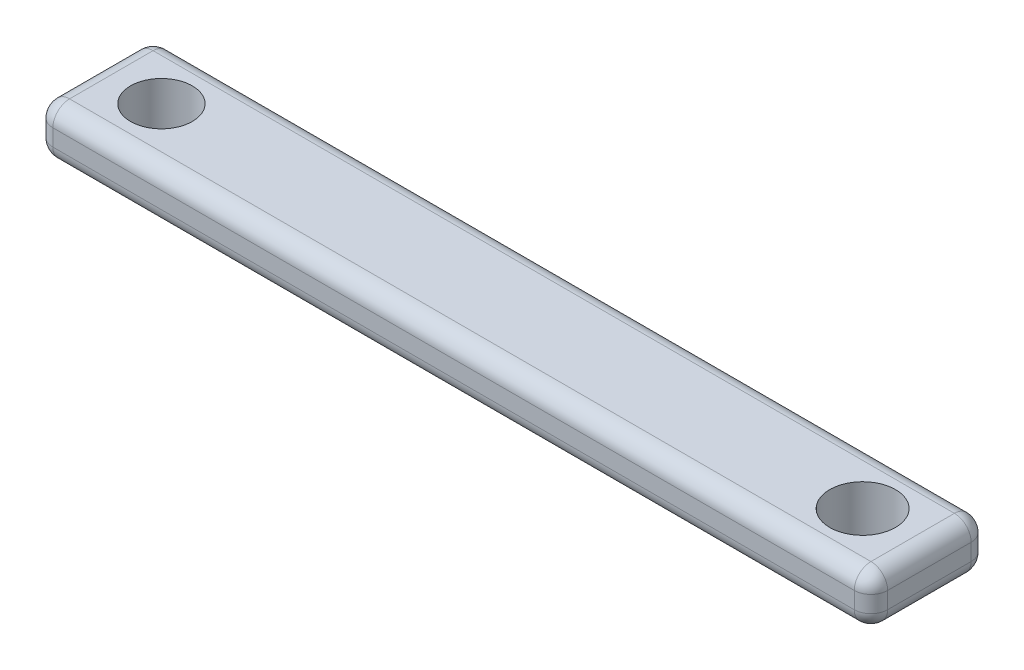
ISO-10303-21;
HEADER;
FILE_DESCRIPTION(('STEP AP214'),'2;1');
FILE_NAME('part.step','',(''),(''),'','','');
FILE_SCHEMA(('AUTOMOTIVE_DESIGN { 1 0 10303 214 1 1 1 1 }'));
ENDSEC;
DATA;
#1=APPLICATION_CONTEXT('core data for automotive mechanical design processes');
#2=APPLICATION_PROTOCOL_DEFINITION('international standard','automotive_design',2000,#1);
#3=PRODUCT_CONTEXT('',#1,'mechanical');
#4=PRODUCT('Part','Part','',(#3));
#5=PRODUCT_RELATED_PRODUCT_CATEGORY('part','',(#4));
#6=PRODUCT_DEFINITION_FORMATION('','',#4);
#7=PRODUCT_DEFINITION_CONTEXT('part definition',#1,'design');
#8=PRODUCT_DEFINITION('design','',#6,#7);
#9=PRODUCT_DEFINITION_SHAPE('','',#8);
#10=(LENGTH_UNIT() NAMED_UNIT(*) SI_UNIT(.MILLI.,.METRE.));
#11=(NAMED_UNIT(*) PLANE_ANGLE_UNIT() SI_UNIT($,.RADIAN.));
#12=(NAMED_UNIT(*) SI_UNIT($,.STERADIAN.) SOLID_ANGLE_UNIT());
#13=UNCERTAINTY_MEASURE_WITH_UNIT(LENGTH_MEASURE(1.E-05),#10,'distance_accuracy_value','');
#14=(GEOMETRIC_REPRESENTATION_CONTEXT(3) GLOBAL_UNCERTAINTY_ASSIGNED_CONTEXT((#13)) GLOBAL_UNIT_ASSIGNED_CONTEXT((#10,
#11,#12)) REPRESENTATION_CONTEXT('',''));
#15=CARTESIAN_POINT('',(0.,0.,0.));
#16=DIRECTION('',(0.,0.,1.));
#17=DIRECTION('',(1.,0.,0.));
#18=AXIS2_PLACEMENT_3D('',#15,#16,#17);
#19=CARTESIAN_POINT('',(-36.5491749174917,3.81,-17.7758085808581));
#20=DIRECTION('',(1.,0.,0.));
#21=DIRECTION('',(0.,0.,-1.));
#22=AXIS2_PLACEMENT_3D('',#19,#20,#21);
#23=PLANE('',#22);
#24=DIRECTION('',(0.,0.,1.));
#25=VECTOR('',#24,1.);
#26=CARTESIAN_POINT('',(-36.5491749174917,2.54,-17.7758085808581));
#27=LINE('',#26,#25);
#28=CARTESIAN_POINT('',(-36.5491749174917,2.54,-10.1558085808581));
#29=VERTEX_POINT('',#28);
#30=CARTESIAN_POINT('',(-36.5491749174917,2.54,-16.5058085808581));
#31=VERTEX_POINT('',#30);
#32=EDGE_CURVE('E130',#29,#31,#27,.F.);
#33=ORIENTED_EDGE('',*,*,#32,.T.);
#34=DIRECTION('',(0.,-1.,0.));
#35=VECTOR('',#34,1.);
#36=CARTESIAN_POINT('',(-36.5491749174917,3.81,-16.5058085808581));
#37=LINE('',#36,#35);
#38=CARTESIAN_POINT('',(-36.5491749174917,1.27,-16.5058085808581));
#39=VERTEX_POINT('',#38);
#40=EDGE_CURVE('E167',#31,#39,#37,.T.);
#41=ORIENTED_EDGE('',*,*,#40,.T.);
#42=DIRECTION('',(0.,0.,1.));
#43=VECTOR('',#42,1.);
#44=CARTESIAN_POINT('',(-36.5491749174917,1.27,-17.7758085808581));
#45=LINE('',#44,#43);
#46=CARTESIAN_POINT('',(-36.5491749174917,1.27,-10.1558085808581));
#47=VERTEX_POINT('',#46);
#48=EDGE_CURVE('E160',#39,#47,#45,.T.);
#49=ORIENTED_EDGE('',*,*,#48,.T.);
#50=DIRECTION('',(0.,-1.,0.));
#51=VECTOR('',#50,1.);
#52=CARTESIAN_POINT('',(-36.5491749174917,3.81,-10.1558085808581));
#53=LINE('',#52,#51);
#54=EDGE_CURVE('E158',#47,#29,#53,.F.);
#55=ORIENTED_EDGE('',*,*,#54,.T.);
#56=EDGE_LOOP('',(#33,#41,#49,#55));
#57=FACE_BOUND('',#56,.T.);
#58=ADVANCED_FACE('F34',(#57),#23,.F.);
#59=CARTESIAN_POINT('',(-36.5491749174917,3.81,-8.88580858085807));
#60=DIRECTION('',(0.,0.,-1.));
#61=DIRECTION('',(-1.,0.,0.));
#62=AXIS2_PLACEMENT_3D('',#59,#60,#61);
#63=PLANE('',#62);
#64=DIRECTION('',(1.,0.,0.));
#65=VECTOR('',#64,1.);
#66=CARTESIAN_POINT('',(-36.5491749174917,2.54,-8.88580858085807));
#67=LINE('',#66,#65);
#68=CARTESIAN_POINT('',(25.6808250825083,2.54,-8.88580858085807));
#69=VERTEX_POINT('',#68);
#70=CARTESIAN_POINT('',(-35.2791749174917,2.54,-8.88580858085807));
#71=VERTEX_POINT('',#70);
#72=EDGE_CURVE('E43',#69,#71,#67,.F.);
#73=ORIENTED_EDGE('',*,*,#72,.T.);
#74=DIRECTION('',(0.,-1.,0.));
#75=VECTOR('',#74,1.);
#76=CARTESIAN_POINT('',(-35.2791749174917,3.81,-8.88580858085807));
#77=LINE('',#76,#75);
#78=CARTESIAN_POINT('',(-35.2791749174917,1.27,-8.88580858085807));
#79=VERTEX_POINT('',#78);
#80=EDGE_CURVE('E11',#71,#79,#77,.T.);
#81=ORIENTED_EDGE('',*,*,#80,.T.);
#82=DIRECTION('',(1.,0.,0.));
#83=VECTOR('',#82,1.);
#84=CARTESIAN_POINT('',(-36.5491749174917,1.27,-8.88580858085807));
#85=LINE('',#84,#83);
#86=CARTESIAN_POINT('',(25.6808250825083,1.27,-8.88580858085807));
#87=VERTEX_POINT('',#86);
#88=EDGE_CURVE('E196',#79,#87,#85,.T.);
#89=ORIENTED_EDGE('',*,*,#88,.T.);
#90=DIRECTION('',(0.,-1.,0.));
#91=VECTOR('',#90,1.);
#92=CARTESIAN_POINT('',(25.6808250825083,3.81,-8.88580858085807));
#93=LINE('',#92,#91);
#94=EDGE_CURVE('E54',#87,#69,#93,.F.);
#95=ORIENTED_EDGE('',*,*,#94,.T.);
#96=EDGE_LOOP('',(#73,#81,#89,#95));
#97=FACE_BOUND('',#96,.T.);
#98=ADVANCED_FACE('F329',(#97),#63,.F.);
#99=CARTESIAN_POINT('',(26.9508250825083,3.81,-17.7758085808581));
#100=DIRECTION('',(-1.,0.,0.));
#101=DIRECTION('',(0.,0.,1.));
#102=AXIS2_PLACEMENT_3D('',#99,#100,#101);
#103=PLANE('',#102);
#104=DIRECTION('',(0.,-1.,0.));
#105=VECTOR('',#104,1.);
#106=CARTESIAN_POINT('',(26.9508250825083,3.81,-16.5058085808581));
#107=LINE('',#106,#105);
#108=CARTESIAN_POINT('',(26.9508250825083,1.27,-16.5058085808581));
#109=VERTEX_POINT('',#108);
#110=CARTESIAN_POINT('',(26.9508250825083,2.54,-16.5058085808581));
#111=VERTEX_POINT('',#110);
#112=EDGE_CURVE('E191',#109,#111,#107,.F.);
#113=ORIENTED_EDGE('',*,*,#112,.T.);
#114=DIRECTION('',(0.,0.,-1.));
#115=VECTOR('',#114,1.);
#116=CARTESIAN_POINT('',(26.9508250825083,2.54,-8.88580858085807));
#117=LINE('',#116,#115);
#118=CARTESIAN_POINT('',(26.9508250825083,2.54,-10.1558085808581));
#119=VERTEX_POINT('',#118);
#120=EDGE_CURVE('E193',#111,#119,#117,.F.);
#121=ORIENTED_EDGE('',*,*,#120,.T.);
#122=DIRECTION('',(0.,-1.,0.));
#123=VECTOR('',#122,1.);
#124=CARTESIAN_POINT('',(26.9508250825083,3.81,-10.1558085808581));
#125=LINE('',#124,#123);
#126=CARTESIAN_POINT('',(26.9508250825083,1.27,-10.1558085808581));
#127=VERTEX_POINT('',#126);
#128=EDGE_CURVE('E187',#119,#127,#125,.T.);
#129=ORIENTED_EDGE('',*,*,#128,.T.);
#130=DIRECTION('',(0.,0.,-1.));
#131=VECTOR('',#130,1.);
#132=CARTESIAN_POINT('',(26.9508250825083,1.27,-17.7758085808581));
#133=LINE('',#132,#131);
#134=EDGE_CURVE('E189',#127,#109,#133,.T.);
#135=ORIENTED_EDGE('',*,*,#134,.T.);
#136=EDGE_LOOP('',(#113,#121,#129,#135));
#137=FACE_BOUND('',#136,.T.);
#138=ADVANCED_FACE('F280',(#137),#103,.F.);
#139=CARTESIAN_POINT('',(-36.5491749174917,3.81,-17.7758085808581));
#140=DIRECTION('',(0.,0.,1.));
#141=DIRECTION('',(1.,0.,0.));
#142=AXIS2_PLACEMENT_3D('',#139,#140,#141);
#143=PLANE('',#142);
#144=DIRECTION('',(0.,-1.,0.));
#145=VECTOR('',#144,1.);
#146=CARTESIAN_POINT('',(-35.2791749174917,3.81,-17.7758085808581));
#147=LINE('',#146,#145);
#148=CARTESIAN_POINT('',(-35.2791749174917,1.27,-17.7758085808581));
#149=VERTEX_POINT('',#148);
#150=CARTESIAN_POINT('',(-35.2791749174917,2.54,-17.7758085808581));
#151=VERTEX_POINT('',#150);
#152=EDGE_CURVE('E182',#149,#151,#147,.F.);
#153=ORIENTED_EDGE('',*,*,#152,.T.);
#154=DIRECTION('',(-1.,0.,0.));
#155=VECTOR('',#154,1.);
#156=CARTESIAN_POINT('',(26.9508250825083,2.54,-17.7758085808581));
#157=LINE('',#156,#155);
#158=CARTESIAN_POINT('',(25.6808250825083,2.54,-17.7758085808581));
#159=VERTEX_POINT('',#158);
#160=EDGE_CURVE('E184',#151,#159,#157,.F.);
#161=ORIENTED_EDGE('',*,*,#160,.T.);
#162=DIRECTION('',(0.,-1.,0.));
#163=VECTOR('',#162,1.);
#164=CARTESIAN_POINT('',(25.6808250825083,3.81,-17.7758085808581));
#165=LINE('',#164,#163);
#166=CARTESIAN_POINT('',(25.6808250825083,1.27,-17.7758085808581));
#167=VERTEX_POINT('',#166);
#168=EDGE_CURVE('E178',#159,#167,#165,.T.);
#169=ORIENTED_EDGE('',*,*,#168,.T.);
#170=DIRECTION('',(-1.,0.,0.));
#171=VECTOR('',#170,1.);
#172=CARTESIAN_POINT('',(-36.5491749174917,1.27,-17.7758085808581));
#173=LINE('',#172,#171);
#174=EDGE_CURVE('E180',#167,#149,#173,.T.);
#175=ORIENTED_EDGE('',*,*,#174,.T.);
#176=EDGE_LOOP('',(#153,#161,#169,#175));
#177=FACE_BOUND('',#176,.T.);
#178=ADVANCED_FACE('F271',(#177),#143,.F.);
#179=CARTESIAN_POINT('',(0.,3.81,0.));
#180=DIRECTION('',(0.,1.,0.));
#181=DIRECTION('',(0.,0.,1.));
#182=AXIS2_PLACEMENT_3D('',#179,#180,#181);
#183=PLANE('',#182);
#184=CARTESIAN_POINT('',(-31.4691749174917,3.81,-13.3308085808581));
#185=DIRECTION('',(0.,1.,0.));
#186=DIRECTION('',(0.,0.,1.));
#187=AXIS2_PLACEMENT_3D('',#184,#185,#186);
#188=CIRCLE('',#187,2.35);
#189=CARTESIAN_POINT('',(-31.4691749174917,3.81,-10.9808085808581));
#190=VERTEX_POINT('',#189);
#191=EDGE_CURVE('E557',#190,#190,#188,.T.);
#192=ORIENTED_EDGE('',*,*,#191,.F.);
#193=EDGE_LOOP('',(#192));
#194=FACE_BOUND('',#193,.T.);
#195=CARTESIAN_POINT('',(21.8708250825083,3.81,-13.3308085808581));
#196=DIRECTION('',(0.,1.,0.));
#197=DIRECTION('',(0.,0.,1.));
#198=AXIS2_PLACEMENT_3D('',#195,#196,#197);
#199=CIRCLE('',#198,2.5);
#200=CARTESIAN_POINT('',(21.8708250825083,3.81,-10.8308085808581));
#201=VERTEX_POINT('',#200);
#202=EDGE_CURVE('E560',#201,#201,#199,.T.);
#203=ORIENTED_EDGE('',*,*,#202,.F.);
#204=EDGE_LOOP('',(#203));
#205=FACE_BOUND('',#204,.T.);
#206=DIRECTION('',(-1.,0.,0.));
#207=VECTOR('',#206,1.);
#208=CARTESIAN_POINT('',(-36.5491749174917,3.81,-16.5058085808581));
#209=LINE('',#208,#207);
#210=CARTESIAN_POINT('',(25.6808250825083,3.81,-16.5058085808581));
#211=VERTEX_POINT('',#210);
#212=CARTESIAN_POINT('',(-35.2791749174917,3.81,-16.5058085808581));
#213=VERTEX_POINT('',#212);
#214=EDGE_CURVE('E156',#211,#213,#209,.T.);
#215=ORIENTED_EDGE('',*,*,#214,.T.);
#216=DIRECTION('',(0.,0.,1.));
#217=VECTOR('',#216,1.);
#218=CARTESIAN_POINT('',(-35.2791749174917,3.81,-8.88580858085807));
#219=LINE('',#218,#217);
#220=CARTESIAN_POINT('',(-35.2791749174917,3.81,-10.1558085808581));
#221=VERTEX_POINT('',#220);
#222=EDGE_CURVE('E128',#213,#221,#219,.T.);
#223=ORIENTED_EDGE('',*,*,#222,.T.);
#224=DIRECTION('',(1.,0.,0.));
#225=VECTOR('',#224,1.);
#226=CARTESIAN_POINT('',(26.9508250825083,3.81,-10.1558085808581));
#227=LINE('',#226,#225);
#228=CARTESIAN_POINT('',(25.6808250825083,3.81,-10.1558085808581));
#229=VERTEX_POINT('',#228);
#230=EDGE_CURVE('E146',#221,#229,#227,.T.);
#231=ORIENTED_EDGE('',*,*,#230,.T.);
#232=DIRECTION('',(0.,0.,-1.));
#233=VECTOR('',#232,1.);
#234=CARTESIAN_POINT('',(25.6808250825083,3.81,-17.7758085808581));
#235=LINE('',#234,#233);
#236=EDGE_CURVE('E152',#229,#211,#235,.T.);
#237=ORIENTED_EDGE('',*,*,#236,.T.);
#238=EDGE_LOOP('',(#215,#223,#231,#237));
#239=FACE_BOUND('',#238,.T.);
#240=ADVANCED_FACE('F154',(#194,#205,#239),#183,.T.);
#241=CARTESIAN_POINT('',(0.,0.,0.));
#242=DIRECTION('',(0.,1.,0.));
#243=DIRECTION('',(0.,0.,1.));
#244=AXIS2_PLACEMENT_3D('',#241,#242,#243);
#245=PLANE('',#244);
#246=CARTESIAN_POINT('',(-31.4691749174917,0.,-13.3308085808581));
#247=DIRECTION('',(0.,1.,0.));
#248=DIRECTION('',(0.,0.,1.));
#249=AXIS2_PLACEMENT_3D('',#246,#247,#248);
#250=CIRCLE('',#249,2.35);
#251=CARTESIAN_POINT('',(-31.4691749174917,0.,-10.9808085808581));
#252=VERTEX_POINT('',#251);
#253=EDGE_CURVE('E134',#252,#252,#250,.T.);
#254=ORIENTED_EDGE('',*,*,#253,.T.);
#255=EDGE_LOOP('',(#254));
#256=FACE_BOUND('',#255,.T.);
#257=CARTESIAN_POINT('',(21.8708250825083,0.,-13.3308085808581));
#258=DIRECTION('',(0.,1.,0.));
#259=DIRECTION('',(0.,0.,1.));
#260=AXIS2_PLACEMENT_3D('',#257,#258,#259);
#261=CIRCLE('',#260,2.5);
#262=CARTESIAN_POINT('',(21.8708250825083,0.,-10.8308085808581));
#263=VERTEX_POINT('',#262);
#264=EDGE_CURVE('E562',#263,#263,#261,.T.);
#265=ORIENTED_EDGE('',*,*,#264,.T.);
#266=EDGE_LOOP('',(#265));
#267=FACE_BOUND('',#266,.T.);
#268=DIRECTION('',(1.,0.,0.));
#269=VECTOR('',#268,1.);
#270=CARTESIAN_POINT('',(0.,0.,-10.1558085808581));
#271=LINE('',#270,#269);
#272=CARTESIAN_POINT('',(25.6808250825083,0.,-10.1558085808581));
#273=VERTEX_POINT('',#272);
#274=CARTESIAN_POINT('',(-35.2791749174917,0.,-10.1558085808581));
#275=VERTEX_POINT('',#274);
#276=EDGE_CURVE('E169',#273,#275,#271,.F.);
#277=ORIENTED_EDGE('',*,*,#276,.T.);
#278=DIRECTION('',(0.,0.,1.));
#279=VECTOR('',#278,1.);
#280=CARTESIAN_POINT('',(-35.2791749174917,0.,0.));
#281=LINE('',#280,#279);
#282=CARTESIAN_POINT('',(-35.2791749174917,0.,-16.5058085808581));
#283=VERTEX_POINT('',#282);
#284=EDGE_CURVE('E175',#275,#283,#281,.F.);
#285=ORIENTED_EDGE('',*,*,#284,.T.);
#286=DIRECTION('',(-1.,0.,0.));
#287=VECTOR('',#286,1.);
#288=CARTESIAN_POINT('',(0.,0.,-16.5058085808581));
#289=LINE('',#288,#287);
#290=CARTESIAN_POINT('',(25.6808250825083,0.,-16.5058085808581));
#291=VERTEX_POINT('',#290);
#292=EDGE_CURVE('E173',#283,#291,#289,.F.);
#293=ORIENTED_EDGE('',*,*,#292,.T.);
#294=DIRECTION('',(0.,0.,-1.));
#295=VECTOR('',#294,1.);
#296=CARTESIAN_POINT('',(25.6808250825083,0.,0.));
#297=LINE('',#296,#295);
#298=EDGE_CURVE('E171',#291,#273,#297,.F.);
#299=ORIENTED_EDGE('',*,*,#298,.T.);
#300=EDGE_LOOP('',(#277,#285,#293,#299));
#301=FACE_BOUND('',#300,.T.);
#302=ADVANCED_FACE('F298',(#256,#267,#301),#245,.F.);
#303=CARTESIAN_POINT('',(25.6808250825083,1.27,-17.7758085808581));
#304=DIRECTION('',(0.,0.,-1.));
#305=DIRECTION('',(-1.,0.,0.));
#306=AXIS2_PLACEMENT_3D('',#303,#304,#305);
#307=CYLINDRICAL_SURFACE('',#306,1.27);
#308=CARTESIAN_POINT('',(25.6808250825083,1.27,-16.5058085808581));
#309=DIRECTION('',(0.,0.,-1.));
#310=DIRECTION('',(-1.,0.,0.));
#311=AXIS2_PLACEMENT_3D('',#308,#309,#310);
#312=CIRCLE('',#311,1.27);
#313=EDGE_CURVE('E38',#109,#291,#312,.T.);
#314=ORIENTED_EDGE('',*,*,#313,.F.);
#315=ORIENTED_EDGE('',*,*,#134,.F.);
#316=CARTESIAN_POINT('',(25.6808250825083,1.27,-10.1558085808581));
#317=DIRECTION('',(0.,0.,1.));
#318=DIRECTION('',(1.,0.,0.));
#319=AXIS2_PLACEMENT_3D('',#316,#317,#318);
#320=CIRCLE('',#319,1.27);
#321=EDGE_CURVE('E248',#273,#127,#320,.T.);
#322=ORIENTED_EDGE('',*,*,#321,.F.);
#323=ORIENTED_EDGE('',*,*,#298,.F.);
#324=EDGE_LOOP('',(#314,#315,#322,#323));
#325=FACE_BOUND('',#324,.T.);
#326=ADVANCED_FACE('F36',(#325),#307,.T.);
#327=CARTESIAN_POINT('',(25.6808250825083,1.27,-16.5058085808581));
#328=DIRECTION('',(0.,0.,1.));
#329=DIRECTION('',(1.,0.,0.));
#330=AXIS2_PLACEMENT_3D('',#327,#328,#329);
#331=SPHERICAL_SURFACE('',#330,1.27);
#332=CARTESIAN_POINT('',(25.6808250825083,1.27,-16.5058085808581));
#333=DIRECTION('',(0.,-1.,0.));
#334=DIRECTION('',(0.,0.,-1.));
#335=AXIS2_PLACEMENT_3D('',#332,#333,#334);
#336=CIRCLE('',#335,1.27);
#337=EDGE_CURVE('E243',#109,#167,#336,.F.);
#338=ORIENTED_EDGE('',*,*,#337,.F.);
#339=ORIENTED_EDGE('',*,*,#313,.T.);
#340=CARTESIAN_POINT('',(25.6808250825083,1.27,-16.5058085808581));
#341=DIRECTION('',(1.,0.,0.));
#342=DIRECTION('',(0.,0.,-1.));
#343=AXIS2_PLACEMENT_3D('',#340,#341,#342);
#344=CIRCLE('',#343,1.27);
#345=EDGE_CURVE('E246',#167,#291,#344,.F.);
#346=ORIENTED_EDGE('',*,*,#345,.F.);
#347=EDGE_LOOP('',(#338,#339,#346));
#348=FACE_BOUND('',#347,.T.);
#349=ADVANCED_FACE('F259',(#348),#331,.T.);
#350=CARTESIAN_POINT('',(25.6808250825083,1.27,-10.1558085808581));
#351=DIRECTION('',(0.,0.,1.));
#352=DIRECTION('',(1.,0.,0.));
#353=AXIS2_PLACEMENT_3D('',#350,#351,#352);
#354=SPHERICAL_SURFACE('',#353,1.27);
#355=CARTESIAN_POINT('',(25.6808250825083,1.27,-10.1558085808581));
#356=DIRECTION('',(1.,0.,0.));
#357=DIRECTION('',(0.,0.,-1.));
#358=AXIS2_PLACEMENT_3D('',#355,#356,#357);
#359=CIRCLE('',#358,1.27);
#360=EDGE_CURVE('E237',#273,#87,#359,.F.);
#361=ORIENTED_EDGE('',*,*,#360,.F.);
#362=ORIENTED_EDGE('',*,*,#321,.T.);
#363=CARTESIAN_POINT('',(25.6808250825083,1.27,-10.1558085808581));
#364=DIRECTION('',(0.,-1.,0.));
#365=DIRECTION('',(0.,0.,-1.));
#366=AXIS2_PLACEMENT_3D('',#363,#364,#365);
#367=CIRCLE('',#366,1.27);
#368=EDGE_CURVE('E240',#87,#127,#367,.F.);
#369=ORIENTED_EDGE('',*,*,#368,.F.);
#370=EDGE_LOOP('',(#361,#362,#369));
#371=FACE_BOUND('',#370,.T.);
#372=ADVANCED_FACE('F291',(#371),#354,.T.);
#373=CARTESIAN_POINT('',(-36.5491749174917,1.27,-16.5058085808581));
#374=DIRECTION('',(-1.,0.,0.));
#375=DIRECTION('',(0.,0.,1.));
#376=AXIS2_PLACEMENT_3D('',#373,#374,#375);
#377=CYLINDRICAL_SURFACE('',#376,1.27);
#378=ORIENTED_EDGE('',*,*,#345,.T.);
#379=ORIENTED_EDGE('',*,*,#292,.F.);
#380=CARTESIAN_POINT('',(-35.2791749174917,1.27,-16.5058085808581));
#381=DIRECTION('',(-1.,0.,0.));
#382=DIRECTION('',(0.,0.,1.));
#383=AXIS2_PLACEMENT_3D('',#380,#381,#382);
#384=CIRCLE('',#383,1.27);
#385=EDGE_CURVE('E232',#149,#283,#384,.T.);
#386=ORIENTED_EDGE('',*,*,#385,.F.);
#387=ORIENTED_EDGE('',*,*,#174,.F.);
#388=EDGE_LOOP('',(#378,#379,#386,#387));
#389=FACE_BOUND('',#388,.T.);
#390=ADVANCED_FACE('F267',(#389),#377,.T.);
#391=CARTESIAN_POINT('',(25.6808250825083,3.81,-16.5058085808581));
#392=DIRECTION('',(0.,-1.,0.));
#393=DIRECTION('',(0.,0.,-1.));
#394=AXIS2_PLACEMENT_3D('',#391,#392,#393);
#395=CYLINDRICAL_SURFACE('',#394,1.27);
#396=ORIENTED_EDGE('',*,*,#337,.T.);
#397=ORIENTED_EDGE('',*,*,#168,.F.);
#398=CARTESIAN_POINT('',(25.6808250825083,2.54,-16.5058085808581));
#399=DIRECTION('',(0.,1.,0.));
#400=DIRECTION('',(0.,0.,1.));
#401=AXIS2_PLACEMENT_3D('',#398,#399,#400);
#402=CIRCLE('',#401,1.27);
#403=EDGE_CURVE('E229',#111,#159,#402,.T.);
#404=ORIENTED_EDGE('',*,*,#403,.F.);
#405=ORIENTED_EDGE('',*,*,#112,.F.);
#406=EDGE_LOOP('',(#396,#397,#404,#405));
#407=FACE_BOUND('',#406,.T.);
#408=ADVANCED_FACE('F277',(#407),#395,.T.);
#409=CARTESIAN_POINT('',(25.6808250825083,2.54,0.));
#410=DIRECTION('',(0.,0.,1.));
#411=DIRECTION('',(1.,0.,0.));
#412=AXIS2_PLACEMENT_3D('',#409,#410,#411);
#413=CYLINDRICAL_SURFACE('',#412,1.27);
#414=CARTESIAN_POINT('',(25.6808250825083,2.54,-10.1558085808581));
#415=DIRECTION('',(0.,0.,1.));
#416=DIRECTION('',(1.,0.,0.));
#417=AXIS2_PLACEMENT_3D('',#414,#415,#416);
#418=CIRCLE('',#417,1.27);
#419=EDGE_CURVE('E223',#119,#229,#418,.T.);
#420=ORIENTED_EDGE('',*,*,#419,.F.);
#421=ORIENTED_EDGE('',*,*,#120,.F.);
#422=CARTESIAN_POINT('',(25.6808250825083,2.54,-16.5058085808581));
#423=DIRECTION('',(0.,0.,-1.));
#424=DIRECTION('',(-1.,0.,0.));
#425=AXIS2_PLACEMENT_3D('',#422,#423,#424);
#426=CIRCLE('',#425,1.27);
#427=EDGE_CURVE('E226',#211,#111,#426,.T.);
#428=ORIENTED_EDGE('',*,*,#427,.F.);
#429=ORIENTED_EDGE('',*,*,#236,.F.);
#430=EDGE_LOOP('',(#420,#421,#428,#429));
#431=FACE_BOUND('',#430,.T.);
#432=ADVANCED_FACE('F284',(#431),#413,.T.);
#433=CARTESIAN_POINT('',(25.6808250825083,3.81,-10.1558085808581));
#434=DIRECTION('',(0.,-1.,0.));
#435=DIRECTION('',(0.,0.,-1.));
#436=AXIS2_PLACEMENT_3D('',#433,#434,#435);
#437=CYLINDRICAL_SURFACE('',#436,1.27);
#438=ORIENTED_EDGE('',*,*,#368,.T.);
#439=ORIENTED_EDGE('',*,*,#128,.F.);
#440=CARTESIAN_POINT('',(25.6808250825083,2.54,-10.1558085808581));
#441=DIRECTION('',(0.,1.,0.));
#442=DIRECTION('',(0.,0.,1.));
#443=AXIS2_PLACEMENT_3D('',#440,#441,#442);
#444=CIRCLE('',#443,1.27);
#445=EDGE_CURVE('E221',#69,#119,#444,.T.);
#446=ORIENTED_EDGE('',*,*,#445,.F.);
#447=ORIENTED_EDGE('',*,*,#94,.F.);
#448=EDGE_LOOP('',(#438,#439,#446,#447));
#449=FACE_BOUND('',#448,.T.);
#450=ADVANCED_FACE('F289',(#449),#437,.T.);
#451=CARTESIAN_POINT('',(-36.5491749174917,1.27,-10.1558085808581));
#452=DIRECTION('',(1.,0.,0.));
#453=DIRECTION('',(0.,0.,-1.));
#454=AXIS2_PLACEMENT_3D('',#451,#452,#453);
#455=CYLINDRICAL_SURFACE('',#454,1.27);
#456=ORIENTED_EDGE('',*,*,#360,.T.);
#457=ORIENTED_EDGE('',*,*,#88,.F.);
#458=CARTESIAN_POINT('',(-35.2791749174917,1.27,-10.1558085808581));
#459=DIRECTION('',(-1.,0.,0.));
#460=DIRECTION('',(0.,0.,1.));
#461=AXIS2_PLACEMENT_3D('',#458,#459,#460);
#462=CIRCLE('',#461,1.27);
#463=EDGE_CURVE('E218',#275,#79,#462,.T.);
#464=ORIENTED_EDGE('',*,*,#463,.F.);
#465=ORIENTED_EDGE('',*,*,#276,.F.);
#466=EDGE_LOOP('',(#456,#457,#464,#465));
#467=FACE_BOUND('',#466,.T.);
#468=ADVANCED_FACE('F295',(#467),#455,.T.);
#469=CARTESIAN_POINT('',(-35.2791749174917,1.27,-17.7758085808581));
#470=DIRECTION('',(0.,0.,1.));
#471=DIRECTION('',(1.,0.,0.));
#472=AXIS2_PLACEMENT_3D('',#469,#470,#471);
#473=CYLINDRICAL_SURFACE('',#472,1.27);
#474=CARTESIAN_POINT('',(-35.2791749174917,1.27,-16.5058085808581));
#475=DIRECTION('',(0.,0.,-1.));
#476=DIRECTION('',(-1.,0.,0.));
#477=AXIS2_PLACEMENT_3D('',#474,#475,#476);
#478=CIRCLE('',#477,1.27);
#479=EDGE_CURVE('E234',#283,#39,#478,.T.);
#480=ORIENTED_EDGE('',*,*,#479,.F.);
#481=ORIENTED_EDGE('',*,*,#284,.F.);
#482=CARTESIAN_POINT('',(-35.2791749174917,1.27,-10.1558085808581));
#483=DIRECTION('',(0.,0.,1.));
#484=DIRECTION('',(1.,0.,0.));
#485=AXIS2_PLACEMENT_3D('',#482,#483,#484);
#486=CIRCLE('',#485,1.27);
#487=EDGE_CURVE('E215',#47,#275,#486,.T.);
#488=ORIENTED_EDGE('',*,*,#487,.F.);
#489=ORIENTED_EDGE('',*,*,#48,.F.);
#490=EDGE_LOOP('',(#480,#481,#488,#489));
#491=FACE_BOUND('',#490,.T.);
#492=ADVANCED_FACE('F302',(#491),#473,.T.);
#493=CARTESIAN_POINT('',(-35.2791749174917,1.27,-16.5058085808581));
#494=DIRECTION('',(0.,0.,1.));
#495=DIRECTION('',(1.,0.,0.));
#496=AXIS2_PLACEMENT_3D('',#493,#494,#495);
#497=SPHERICAL_SURFACE('',#496,1.27);
#498=ORIENTED_EDGE('',*,*,#385,.T.);
#499=ORIENTED_EDGE('',*,*,#479,.T.);
#500=CARTESIAN_POINT('',(-35.2791749174917,1.27,-16.5058085808581));
#501=DIRECTION('',(0.,-1.,0.));
#502=DIRECTION('',(0.,0.,-1.));
#503=AXIS2_PLACEMENT_3D('',#500,#501,#502);
#504=CIRCLE('',#503,1.27);
#505=EDGE_CURVE('E212',#149,#39,#504,.F.);
#506=ORIENTED_EDGE('',*,*,#505,.F.);
#507=EDGE_LOOP('',(#498,#499,#506));
#508=FACE_BOUND('',#507,.T.);
#509=ADVANCED_FACE('F306',(#508),#497,.T.);
#510=CARTESIAN_POINT('',(25.6808250825083,2.54,-16.5058085808581));
#511=DIRECTION('',(0.,0.,1.));
#512=DIRECTION('',(1.,0.,0.));
#513=AXIS2_PLACEMENT_3D('',#510,#511,#512);
#514=SPHERICAL_SURFACE('',#513,1.27);
#515=ORIENTED_EDGE('',*,*,#427,.T.);
#516=ORIENTED_EDGE('',*,*,#403,.T.);
#517=CARTESIAN_POINT('',(25.6808250825083,2.54,-16.5058085808581));
#518=DIRECTION('',(1.,0.,0.));
#519=DIRECTION('',(0.,0.,-1.));
#520=AXIS2_PLACEMENT_3D('',#517,#518,#519);
#521=CIRCLE('',#520,1.27);
#522=EDGE_CURVE('E210',#211,#159,#521,.F.);
#523=ORIENTED_EDGE('',*,*,#522,.F.);
#524=EDGE_LOOP('',(#515,#516,#523));
#525=FACE_BOUND('',#524,.T.);
#526=ADVANCED_FACE('F317',(#525),#514,.T.);
#527=CARTESIAN_POINT('',(25.6808250825083,2.54,-10.1558085808581));
#528=DIRECTION('',(0.,0.,1.));
#529=DIRECTION('',(1.,0.,0.));
#530=AXIS2_PLACEMENT_3D('',#527,#528,#529);
#531=SPHERICAL_SURFACE('',#530,1.27);
#532=ORIENTED_EDGE('',*,*,#445,.T.);
#533=ORIENTED_EDGE('',*,*,#419,.T.);
#534=CARTESIAN_POINT('',(25.6808250825083,2.54,-10.1558085808581));
#535=DIRECTION('',(1.,0.,0.));
#536=DIRECTION('',(0.,0.,-1.));
#537=AXIS2_PLACEMENT_3D('',#534,#535,#536);
#538=CIRCLE('',#537,1.27);
#539=EDGE_CURVE('E149',#69,#229,#538,.F.);
#540=ORIENTED_EDGE('',*,*,#539,.F.);
#541=EDGE_LOOP('',(#532,#533,#540));
#542=FACE_BOUND('',#541,.T.);
#543=ADVANCED_FACE('F319',(#542),#531,.T.);
#544=CARTESIAN_POINT('',(-35.2791749174917,1.27,-10.1558085808581));
#545=DIRECTION('',(0.,0.,1.));
#546=DIRECTION('',(1.,0.,0.));
#547=AXIS2_PLACEMENT_3D('',#544,#545,#546);
#548=SPHERICAL_SURFACE('',#547,1.27);
#549=ORIENTED_EDGE('',*,*,#487,.T.);
#550=ORIENTED_EDGE('',*,*,#463,.T.);
#551=CARTESIAN_POINT('',(-35.2791749174917,1.27,-10.1558085808581));
#552=DIRECTION('',(0.,-1.,0.));
#553=DIRECTION('',(0.,0.,-1.));
#554=AXIS2_PLACEMENT_3D('',#551,#552,#553);
#555=CIRCLE('',#554,1.27);
#556=EDGE_CURVE('E207',#47,#79,#555,.F.);
#557=ORIENTED_EDGE('',*,*,#556,.F.);
#558=EDGE_LOOP('',(#549,#550,#557));
#559=FACE_BOUND('',#558,.T.);
#560=ADVANCED_FACE('F325',(#559),#548,.T.);
#561=CARTESIAN_POINT('',(-35.2791749174917,3.81,-16.5058085808581));
#562=DIRECTION('',(0.,-1.,0.));
#563=DIRECTION('',(0.,0.,-1.));
#564=AXIS2_PLACEMENT_3D('',#561,#562,#563);
#565=CYLINDRICAL_SURFACE('',#564,1.27);
#566=ORIENTED_EDGE('',*,*,#505,.T.);
#567=ORIENTED_EDGE('',*,*,#40,.F.);
#568=CARTESIAN_POINT('',(-35.2791749174917,2.54,-16.5058085808581));
#569=DIRECTION('',(0.,1.,0.));
#570=DIRECTION('',(0.,0.,1.));
#571=AXIS2_PLACEMENT_3D('',#568,#569,#570);
#572=CIRCLE('',#571,1.27);
#573=EDGE_CURVE('E204',#151,#31,#572,.T.);
#574=ORIENTED_EDGE('',*,*,#573,.F.);
#575=ORIENTED_EDGE('',*,*,#152,.F.);
#576=EDGE_LOOP('',(#566,#567,#574,#575));
#577=FACE_BOUND('',#576,.T.);
#578=ADVANCED_FACE('F309',(#577),#565,.T.);
#579=CARTESIAN_POINT('',(0.,2.54,-16.5058085808581));
#580=DIRECTION('',(1.,0.,0.));
#581=DIRECTION('',(0.,0.,-1.));
#582=AXIS2_PLACEMENT_3D('',#579,#580,#581);
#583=CYLINDRICAL_SURFACE('',#582,1.27);
#584=ORIENTED_EDGE('',*,*,#522,.T.);
#585=ORIENTED_EDGE('',*,*,#160,.F.);
#586=CARTESIAN_POINT('',(-35.2791749174917,2.54,-16.5058085808581));
#587=DIRECTION('',(-1.,0.,0.));
#588=DIRECTION('',(0.,0.,1.));
#589=AXIS2_PLACEMENT_3D('',#586,#587,#588);
#590=CIRCLE('',#589,1.27);
#591=EDGE_CURVE('E143',#213,#151,#590,.T.);
#592=ORIENTED_EDGE('',*,*,#591,.F.);
#593=ORIENTED_EDGE('',*,*,#214,.F.);
#594=EDGE_LOOP('',(#584,#585,#592,#593));
#595=FACE_BOUND('',#594,.T.);
#596=ADVANCED_FACE('F315',(#595),#583,.T.);
#597=CARTESIAN_POINT('',(0.,2.54,-10.1558085808581));
#598=DIRECTION('',(-1.,0.,0.));
#599=DIRECTION('',(0.,0.,1.));
#600=AXIS2_PLACEMENT_3D('',#597,#598,#599);
#601=CYLINDRICAL_SURFACE('',#600,1.27);
#602=ORIENTED_EDGE('',*,*,#539,.T.);
#603=ORIENTED_EDGE('',*,*,#230,.F.);
#604=CARTESIAN_POINT('',(-35.2791749174917,2.54,-10.1558085808581));
#605=DIRECTION('',(-1.,0.,0.));
#606=DIRECTION('',(0.,0.,1.));
#607=AXIS2_PLACEMENT_3D('',#604,#605,#606);
#608=CIRCLE('',#607,1.27);
#609=EDGE_CURVE('E137',#71,#221,#608,.T.);
#610=ORIENTED_EDGE('',*,*,#609,.F.);
#611=ORIENTED_EDGE('',*,*,#72,.F.);
#612=EDGE_LOOP('',(#602,#603,#610,#611));
#613=FACE_BOUND('',#612,.T.);
#614=ADVANCED_FACE('F147',(#613),#601,.T.);
#615=CARTESIAN_POINT('',(-35.2791749174917,3.81,-10.1558085808581));
#616=DIRECTION('',(0.,-1.,0.));
#617=DIRECTION('',(0.,0.,-1.));
#618=AXIS2_PLACEMENT_3D('',#615,#616,#617);
#619=CYLINDRICAL_SURFACE('',#618,1.27);
#620=ORIENTED_EDGE('',*,*,#556,.T.);
#621=ORIENTED_EDGE('',*,*,#80,.F.);
#622=CARTESIAN_POINT('',(-35.2791749174917,2.54,-10.1558085808581));
#623=DIRECTION('',(0.,1.,0.));
#624=DIRECTION('',(0.,0.,1.));
#625=AXIS2_PLACEMENT_3D('',#622,#623,#624);
#626=CIRCLE('',#625,1.27);
#627=EDGE_CURVE('E141',#29,#71,#626,.T.);
#628=ORIENTED_EDGE('',*,*,#627,.F.);
#629=ORIENTED_EDGE('',*,*,#54,.F.);
#630=EDGE_LOOP('',(#620,#621,#628,#629));
#631=FACE_BOUND('',#630,.T.);
#632=ADVANCED_FACE('F345',(#631),#619,.T.);
#633=CARTESIAN_POINT('',(-35.2791749174917,2.54,-16.5058085808581));
#634=DIRECTION('',(0.,0.,1.));
#635=DIRECTION('',(1.,0.,0.));
#636=AXIS2_PLACEMENT_3D('',#633,#634,#635);
#637=SPHERICAL_SURFACE('',#636,1.27);
#638=ORIENTED_EDGE('',*,*,#591,.T.);
#639=ORIENTED_EDGE('',*,*,#573,.T.);
#640=CARTESIAN_POINT('',(-35.2791749174917,2.54,-16.5058085808581));
#641=DIRECTION('',(0.,0.,-1.));
#642=DIRECTION('',(-1.,0.,0.));
#643=AXIS2_PLACEMENT_3D('',#640,#641,#642);
#644=CIRCLE('',#643,1.27);
#645=EDGE_CURVE('E133',#213,#31,#644,.F.);
#646=ORIENTED_EDGE('',*,*,#645,.F.);
#647=EDGE_LOOP('',(#638,#639,#646));
#648=FACE_BOUND('',#647,.T.);
#649=ADVANCED_FACE('F313',(#648),#637,.T.);
#650=CARTESIAN_POINT('',(-35.2791749174917,2.54,-10.1558085808581));
#651=DIRECTION('',(0.,0.,1.));
#652=DIRECTION('',(1.,0.,0.));
#653=AXIS2_PLACEMENT_3D('',#650,#651,#652);
#654=SPHERICAL_SURFACE('',#653,1.27);
#655=ORIENTED_EDGE('',*,*,#627,.T.);
#656=ORIENTED_EDGE('',*,*,#609,.T.);
#657=CARTESIAN_POINT('',(-35.2791749174917,2.54,-10.1558085808581));
#658=DIRECTION('',(0.,0.,1.));
#659=DIRECTION('',(1.,0.,0.));
#660=AXIS2_PLACEMENT_3D('',#657,#658,#659);
#661=CIRCLE('',#660,1.27);
#662=EDGE_CURVE('E124',#29,#221,#661,.F.);
#663=ORIENTED_EDGE('',*,*,#662,.F.);
#664=EDGE_LOOP('',(#655,#656,#663));
#665=FACE_BOUND('',#664,.T.);
#666=ADVANCED_FACE('F139',(#665),#654,.T.);
#667=CARTESIAN_POINT('',(-35.2791749174917,2.54,0.));
#668=DIRECTION('',(0.,0.,-1.));
#669=DIRECTION('',(-1.,0.,0.));
#670=AXIS2_PLACEMENT_3D('',#667,#668,#669);
#671=CYLINDRICAL_SURFACE('',#670,1.27);
#672=ORIENTED_EDGE('',*,*,#645,.T.);
#673=ORIENTED_EDGE('',*,*,#32,.F.);
#674=ORIENTED_EDGE('',*,*,#662,.T.);
#675=ORIENTED_EDGE('',*,*,#222,.F.);
#676=EDGE_LOOP('',(#672,#673,#674,#675));
#677=FACE_BOUND('',#676,.T.);
#678=ADVANCED_FACE('F126',(#677),#671,.T.);
#679=CARTESIAN_POINT('',(21.8708250825083,0.,-13.3308085808581));
#680=DIRECTION('',(0.,1.,0.));
#681=DIRECTION('',(0.,0.,1.));
#682=AXIS2_PLACEMENT_3D('',#679,#680,#681);
#683=CYLINDRICAL_SURFACE('',#682,2.5);
#684=CARTESIAN_POINT('',(21.8708250825083,0.,-10.8308085808581));
#685=CARTESIAN_POINT('',(21.8708250825083,0.0396874999999999,-10.8308085808581));
#686=CARTESIAN_POINT('',(21.8708250825083,0.079375,-10.8308085808581));
#687=CARTESIAN_POINT('',(21.8708250825083,0.15875,-10.8308085808581));
#688=CARTESIAN_POINT('',(21.8708250825083,0.1984375,-10.8308085808581));
#689=CARTESIAN_POINT('',(21.8708250825083,0.2778125,-10.8308085808581));
#690=CARTESIAN_POINT('',(21.8708250825083,0.3175,-10.8308085808581));
#691=CARTESIAN_POINT('',(21.8708250825083,0.396875,-10.8308085808581));
#692=CARTESIAN_POINT('',(21.8708250825083,0.4365625,-10.8308085808581));
#693=CARTESIAN_POINT('',(21.8708250825083,0.5159375,-10.8308085808581));
#694=CARTESIAN_POINT('',(21.8708250825083,0.555625,-10.8308085808581));
#695=CARTESIAN_POINT('',(21.8708250825083,0.635,-10.8308085808581));
#696=CARTESIAN_POINT('',(21.8708250825083,0.6746875,-10.8308085808581));
#697=CARTESIAN_POINT('',(21.8708250825083,0.7540625,-10.8308085808581));
#698=CARTESIAN_POINT('',(21.8708250825083,0.79375,-10.8308085808581));
#699=CARTESIAN_POINT('',(21.8708250825083,0.873125,-10.8308085808581));
#700=CARTESIAN_POINT('',(21.8708250825083,0.9128125,-10.8308085808581));
#701=CARTESIAN_POINT('',(21.8708250825083,0.9921875,-10.8308085808581));
#702=CARTESIAN_POINT('',(21.8708250825083,1.031875,-10.8308085808581));
#703=CARTESIAN_POINT('',(21.8708250825083,1.11125,-10.8308085808581));
#704=CARTESIAN_POINT('',(21.8708250825083,1.1509375,-10.8308085808581));
#705=CARTESIAN_POINT('',(21.8708250825083,1.2303125,-10.8308085808581));
#706=CARTESIAN_POINT('',(21.8708250825083,1.27,-10.8308085808581));
#707=CARTESIAN_POINT('',(21.8708250825083,1.349375,-10.8308085808581));
#708=CARTESIAN_POINT('',(21.8708250825083,1.3890625,-10.8308085808581));
#709=CARTESIAN_POINT('',(21.8708250825083,1.4684375,-10.8308085808581));
#710=CARTESIAN_POINT('',(21.8708250825083,1.508125,-10.8308085808581));
#711=CARTESIAN_POINT('',(21.8708250825083,1.5875,-10.8308085808581));
#712=CARTESIAN_POINT('',(21.8708250825083,1.6271875,-10.8308085808581));
#713=CARTESIAN_POINT('',(21.8708250825083,1.7065625,-10.8308085808581));
#714=CARTESIAN_POINT('',(21.8708250825083,1.74625,-10.8308085808581));
#715=CARTESIAN_POINT('',(21.8708250825083,1.825625,-10.8308085808581));
#716=CARTESIAN_POINT('',(21.8708250825083,1.8653125,-10.8308085808581));
#717=CARTESIAN_POINT('',(21.8708250825083,1.9446875,-10.8308085808581));
#718=CARTESIAN_POINT('',(21.8708250825083,1.984375,-10.8308085808581));
#719=CARTESIAN_POINT('',(21.8708250825083,2.06375,-10.8308085808581));
#720=CARTESIAN_POINT('',(21.8708250825083,2.1034375,-10.8308085808581));
#721=CARTESIAN_POINT('',(21.8708250825083,2.1828125,-10.8308085808581));
#722=CARTESIAN_POINT('',(21.8708250825083,2.2225,-10.8308085808581));
#723=CARTESIAN_POINT('',(21.8708250825083,2.301875,-10.8308085808581));
#724=CARTESIAN_POINT('',(21.8708250825083,2.3415625,-10.8308085808581));
#725=CARTESIAN_POINT('',(21.8708250825083,2.4209375,-10.8308085808581));
#726=CARTESIAN_POINT('',(21.8708250825083,2.460625,-10.8308085808581));
#727=CARTESIAN_POINT('',(21.8708250825083,2.54,-10.8308085808581));
#728=CARTESIAN_POINT('',(21.8708250825083,2.5796875,-10.8308085808581));
#729=CARTESIAN_POINT('',(21.8708250825083,2.6590625,-10.8308085808581));
#730=CARTESIAN_POINT('',(21.8708250825083,2.69875,-10.8308085808581));
#731=CARTESIAN_POINT('',(21.8708250825083,2.778125,-10.8308085808581));
#732=CARTESIAN_POINT('',(21.8708250825083,2.8178125,-10.8308085808581));
#733=CARTESIAN_POINT('',(21.8708250825083,2.8971875,-10.8308085808581));
#734=CARTESIAN_POINT('',(21.8708250825083,2.936875,-10.8308085808581));
#735=CARTESIAN_POINT('',(21.8708250825083,3.01625,-10.8308085808581));
#736=CARTESIAN_POINT('',(21.8708250825083,3.0559375,-10.8308085808581));
#737=CARTESIAN_POINT('',(21.8708250825083,3.1353125,-10.8308085808581));
#738=CARTESIAN_POINT('',(21.8708250825083,3.175,-10.8308085808581));
#739=CARTESIAN_POINT('',(21.8708250825083,3.254375,-10.8308085808581));
#740=CARTESIAN_POINT('',(21.8708250825083,3.2940625,-10.8308085808581));
#741=CARTESIAN_POINT('',(21.8708250825083,3.3734375,-10.8308085808581));
#742=CARTESIAN_POINT('',(21.8708250825083,3.413125,-10.8308085808581));
#743=CARTESIAN_POINT('',(21.8708250825083,3.4925,-10.8308085808581));
#744=CARTESIAN_POINT('',(21.8708250825083,3.5321875,-10.8308085808581));
#745=CARTESIAN_POINT('',(21.8708250825083,3.6115625,-10.8308085808581));
#746=CARTESIAN_POINT('',(21.8708250825083,3.65125,-10.8308085808581));
#747=CARTESIAN_POINT('',(21.8708250825083,3.730625,-10.8308085808581));
#748=CARTESIAN_POINT('',(21.8708250825083,3.7703125,-10.8308085808581));
#749=CARTESIAN_POINT('',(21.8708250825083,3.81,-10.8308085808581));
#750=B_SPLINE_CURVE_WITH_KNOTS('',3,(#684,#685,#686,#687,#688,#689,#690,#691,#692,#693,#694,
#695,#696,#697,#698,#699,#700,#701,#702,#703,#704,#705,#706,#707,#708,#709,#710,#711,#712,#713,
#714,#715,#716,#717,#718,#719,#720,#721,#722,#723,#724,#725,#726,#727,#728,#729,#730,#731,#732,
#733,#734,#735,#736,#737,#738,#739,#740,#741,#742,#743,#744,#745,#746,#747,#748,#749),
.UNSPECIFIED.,.F.,.F.,(4,2,2,2,2,2,2,2,2,2,2,2,2,2,2,2,2,2,2,2,2,2,2,2,2,2,2,2,2,2,2,2,4),(0.,
0.1190625,0.238125,0.3571875,0.47625,0.5953125,0.714375,0.8334375,0.9525,1.0715625,1.190625,
1.3096875,1.42875,1.5478125,1.666875,1.7859375,1.905,2.0240625,2.143125,2.2621875,2.38125,
2.5003125,2.619375,2.7384375,2.8575,2.9765625,3.095625,3.2146875,3.33375,3.4528125,3.571875,
3.6909375,3.81),.UNSPECIFIED.);
#751=EDGE_CURVE('BSEAM340',#263,#201,#750,.T.);
#752=ORIENTED_EDGE('',*,*,#264,.F.);
#753=ORIENTED_EDGE('',*,*,#202,.T.);
#754=ORIENTED_EDGE('',*,*,#751,.T.);
#755=ORIENTED_EDGE('',*,*,#751,.F.);
#756=EDGE_LOOP('',(#752,#754,#753,#755));
#757=FACE_BOUND('',#756,.T.);
#758=ADVANCED_FACE('F340',(#757),#683,.F.);
#759=CARTESIAN_POINT('',(-31.4691749174917,0.,-13.3308085808581));
#760=DIRECTION('',(0.,1.,0.));
#761=DIRECTION('',(0.,0.,1.));
#762=AXIS2_PLACEMENT_3D('',#759,#760,#761);
#763=CYLINDRICAL_SURFACE('',#762,2.35);
#764=CARTESIAN_POINT('',(-31.4691749174917,0.,-10.9808085808581));
#765=CARTESIAN_POINT('',(-31.4691749174917,0.0396874999999999,-10.9808085808581));
#766=CARTESIAN_POINT('',(-31.4691749174917,0.079375,-10.9808085808581));
#767=CARTESIAN_POINT('',(-31.4691749174917,0.15875,-10.9808085808581));
#768=CARTESIAN_POINT('',(-31.4691749174917,0.1984375,-10.9808085808581));
#769=CARTESIAN_POINT('',(-31.4691749174917,0.2778125,-10.9808085808581));
#770=CARTESIAN_POINT('',(-31.4691749174917,0.3175,-10.9808085808581));
#771=CARTESIAN_POINT('',(-31.4691749174917,0.396875,-10.9808085808581));
#772=CARTESIAN_POINT('',(-31.4691749174917,0.4365625,-10.9808085808581));
#773=CARTESIAN_POINT('',(-31.4691749174917,0.5159375,-10.9808085808581));
#774=CARTESIAN_POINT('',(-31.4691749174917,0.555625,-10.9808085808581));
#775=CARTESIAN_POINT('',(-31.4691749174917,0.635,-10.9808085808581));
#776=CARTESIAN_POINT('',(-31.4691749174917,0.6746875,-10.9808085808581));
#777=CARTESIAN_POINT('',(-31.4691749174917,0.7540625,-10.9808085808581));
#778=CARTESIAN_POINT('',(-31.4691749174917,0.79375,-10.9808085808581));
#779=CARTESIAN_POINT('',(-31.4691749174917,0.873125,-10.9808085808581));
#780=CARTESIAN_POINT('',(-31.4691749174917,0.9128125,-10.9808085808581));
#781=CARTESIAN_POINT('',(-31.4691749174917,0.9921875,-10.9808085808581));
#782=CARTESIAN_POINT('',(-31.4691749174917,1.031875,-10.9808085808581));
#783=CARTESIAN_POINT('',(-31.4691749174917,1.11125,-10.9808085808581));
#784=CARTESIAN_POINT('',(-31.4691749174917,1.1509375,-10.9808085808581));
#785=CARTESIAN_POINT('',(-31.4691749174917,1.2303125,-10.9808085808581));
#786=CARTESIAN_POINT('',(-31.4691749174917,1.27,-10.9808085808581));
#787=CARTESIAN_POINT('',(-31.4691749174917,1.349375,-10.9808085808581));
#788=CARTESIAN_POINT('',(-31.4691749174917,1.3890625,-10.9808085808581));
#789=CARTESIAN_POINT('',(-31.4691749174917,1.4684375,-10.9808085808581));
#790=CARTESIAN_POINT('',(-31.4691749174917,1.508125,-10.9808085808581));
#791=CARTESIAN_POINT('',(-31.4691749174917,1.5875,-10.9808085808581));
#792=CARTESIAN_POINT('',(-31.4691749174917,1.6271875,-10.9808085808581));
#793=CARTESIAN_POINT('',(-31.4691749174917,1.7065625,-10.9808085808581));
#794=CARTESIAN_POINT('',(-31.4691749174917,1.74625,-10.9808085808581));
#795=CARTESIAN_POINT('',(-31.4691749174917,1.825625,-10.9808085808581));
#796=CARTESIAN_POINT('',(-31.4691749174917,1.8653125,-10.9808085808581));
#797=CARTESIAN_POINT('',(-31.4691749174917,1.9446875,-10.9808085808581));
#798=CARTESIAN_POINT('',(-31.4691749174917,1.984375,-10.9808085808581));
#799=CARTESIAN_POINT('',(-31.4691749174917,2.06375,-10.9808085808581));
#800=CARTESIAN_POINT('',(-31.4691749174917,2.1034375,-10.9808085808581));
#801=CARTESIAN_POINT('',(-31.4691749174917,2.1828125,-10.9808085808581));
#802=CARTESIAN_POINT('',(-31.4691749174917,2.2225,-10.9808085808581));
#803=CARTESIAN_POINT('',(-31.4691749174917,2.301875,-10.9808085808581));
#804=CARTESIAN_POINT('',(-31.4691749174917,2.3415625,-10.9808085808581));
#805=CARTESIAN_POINT('',(-31.4691749174917,2.4209375,-10.9808085808581));
#806=CARTESIAN_POINT('',(-31.4691749174917,2.460625,-10.9808085808581));
#807=CARTESIAN_POINT('',(-31.4691749174917,2.54,-10.9808085808581));
#808=CARTESIAN_POINT('',(-31.4691749174917,2.5796875,-10.9808085808581));
#809=CARTESIAN_POINT('',(-31.4691749174917,2.6590625,-10.9808085808581));
#810=CARTESIAN_POINT('',(-31.4691749174917,2.69875,-10.9808085808581));
#811=CARTESIAN_POINT('',(-31.4691749174917,2.778125,-10.9808085808581));
#812=CARTESIAN_POINT('',(-31.4691749174917,2.8178125,-10.9808085808581));
#813=CARTESIAN_POINT('',(-31.4691749174917,2.8971875,-10.9808085808581));
#814=CARTESIAN_POINT('',(-31.4691749174917,2.936875,-10.9808085808581));
#815=CARTESIAN_POINT('',(-31.4691749174917,3.01625,-10.9808085808581));
#816=CARTESIAN_POINT('',(-31.4691749174917,3.0559375,-10.9808085808581));
#817=CARTESIAN_POINT('',(-31.4691749174917,3.1353125,-10.9808085808581));
#818=CARTESIAN_POINT('',(-31.4691749174917,3.175,-10.9808085808581));
#819=CARTESIAN_POINT('',(-31.4691749174917,3.254375,-10.9808085808581));
#820=CARTESIAN_POINT('',(-31.4691749174917,3.2940625,-10.9808085808581));
#821=CARTESIAN_POINT('',(-31.4691749174917,3.3734375,-10.9808085808581));
#822=CARTESIAN_POINT('',(-31.4691749174917,3.413125,-10.9808085808581));
#823=CARTESIAN_POINT('',(-31.4691749174917,3.4925,-10.9808085808581));
#824=CARTESIAN_POINT('',(-31.4691749174917,3.5321875,-10.9808085808581));
#825=CARTESIAN_POINT('',(-31.4691749174917,3.6115625,-10.9808085808581));
#826=CARTESIAN_POINT('',(-31.4691749174917,3.65125,-10.9808085808581));
#827=CARTESIAN_POINT('',(-31.4691749174917,3.730625,-10.9808085808581));
#828=CARTESIAN_POINT('',(-31.4691749174917,3.7703125,-10.9808085808581));
#829=CARTESIAN_POINT('',(-31.4691749174917,3.81,-10.9808085808581));
#830=B_SPLINE_CURVE_WITH_KNOTS('',3,(#764,#765,#766,#767,#768,#769,#770,#771,#772,#773,#774,
#775,#776,#777,#778,#779,#780,#781,#782,#783,#784,#785,#786,#787,#788,#789,#790,#791,#792,#793,
#794,#795,#796,#797,#798,#799,#800,#801,#802,#803,#804,#805,#806,#807,#808,#809,#810,#811,#812,
#813,#814,#815,#816,#817,#818,#819,#820,#821,#822,#823,#824,#825,#826,#827,#828,#829),
.UNSPECIFIED.,.F.,.F.,(4,2,2,2,2,2,2,2,2,2,2,2,2,2,2,2,2,2,2,2,2,2,2,2,2,2,2,2,2,2,2,2,4),(0.,
0.1190625,0.238125,0.3571875,0.47625,0.5953125,0.714375,0.8334375,0.9525,1.0715625,1.190625,
1.3096875,1.42875,1.5478125,1.666875,1.7859375,1.905,2.0240625,2.143125,2.2621875,2.38125,
2.5003125,2.619375,2.7384375,2.8575,2.9765625,3.095625,3.2146875,3.33375,3.4528125,3.571875,
3.6909375,3.81),.UNSPECIFIED.);
#831=EDGE_CURVE('BSEAM397',#252,#190,#830,.T.);
#832=ORIENTED_EDGE('',*,*,#253,.F.);
#833=ORIENTED_EDGE('',*,*,#191,.T.);
#834=ORIENTED_EDGE('',*,*,#831,.T.);
#835=ORIENTED_EDGE('',*,*,#831,.F.);
#836=EDGE_LOOP('',(#832,#834,#833,#835));
#837=FACE_BOUND('',#836,.T.);
#838=ADVANCED_FACE('F397',(#837),#763,.F.);
#839=CLOSED_SHELL('',(#58,#98,#138,#178,#240,#302,#326,#349,#372,#390,#408,#432,#450,#468,#492,
#509,#526,#543,#560,#578,#596,#614,#632,#649,#666,#678,#758,#838));
#840=MANIFOLD_SOLID_BREP('B2',#839);
#841=ADVANCED_BREP_SHAPE_REPRESENTATION('',(#18,#840),#14);
#842=SHAPE_DEFINITION_REPRESENTATION(#9,#841);
ENDSEC;
END-ISO-10303-21;
